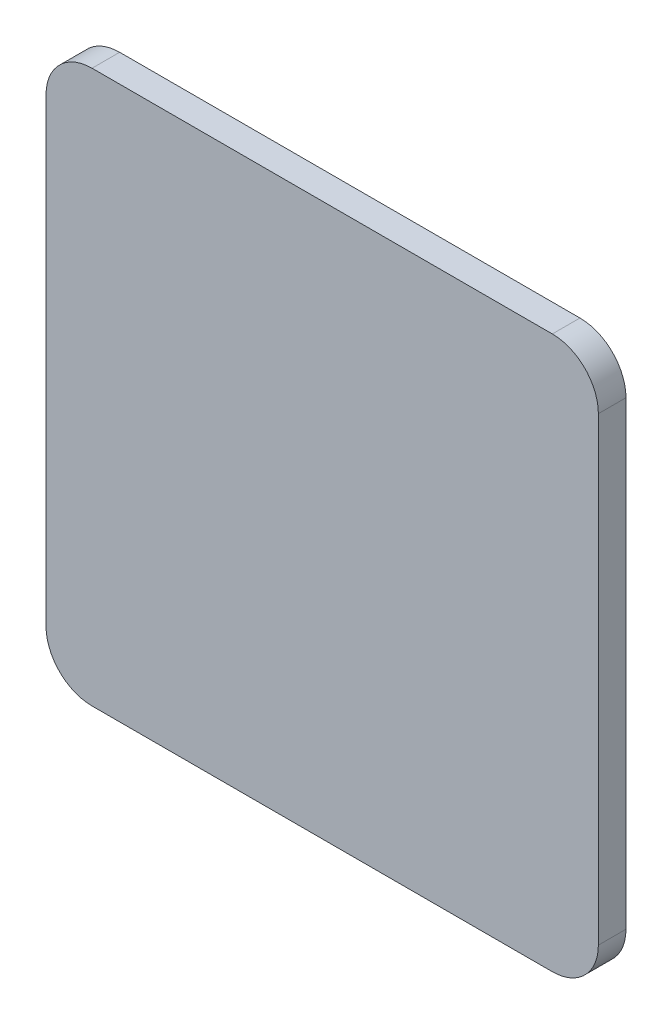
ISO-10303-21;
HEADER;
FILE_DESCRIPTION(('STEP AP214'),'2;1');
FILE_NAME('part.step','',(''),(''),'','','');
FILE_SCHEMA(('AUTOMOTIVE_DESIGN { 1 0 10303 214 1 1 1 1 }'));
ENDSEC;
DATA;
#1=APPLICATION_CONTEXT('core data for automotive mechanical design processes');
#2=APPLICATION_PROTOCOL_DEFINITION('international standard','automotive_design',2000,#1);
#3=PRODUCT_CONTEXT('',#1,'mechanical');
#4=PRODUCT('Part','Part','',(#3));
#5=PRODUCT_RELATED_PRODUCT_CATEGORY('part','',(#4));
#6=PRODUCT_DEFINITION_FORMATION('','',#4);
#7=PRODUCT_DEFINITION_CONTEXT('part definition',#1,'design');
#8=PRODUCT_DEFINITION('design','',#6,#7);
#9=PRODUCT_DEFINITION_SHAPE('','',#8);
#10=(LENGTH_UNIT() NAMED_UNIT(*) SI_UNIT(.MILLI.,.METRE.));
#11=(NAMED_UNIT(*) PLANE_ANGLE_UNIT() SI_UNIT($,.RADIAN.));
#12=(NAMED_UNIT(*) SI_UNIT($,.STERADIAN.) SOLID_ANGLE_UNIT());
#13=UNCERTAINTY_MEASURE_WITH_UNIT(LENGTH_MEASURE(1.E-05),#10,'distance_accuracy_value','');
#14=(GEOMETRIC_REPRESENTATION_CONTEXT(3) GLOBAL_UNCERTAINTY_ASSIGNED_CONTEXT((#13)) GLOBAL_UNIT_ASSIGNED_CONTEXT((#10,
#11,#12)) REPRESENTATION_CONTEXT('',''));
#15=CARTESIAN_POINT('',(0.,0.,0.));
#16=DIRECTION('',(0.,0.,1.));
#17=DIRECTION('',(1.,0.,0.));
#18=AXIS2_PLACEMENT_3D('',#15,#16,#17);
#19=CARTESIAN_POINT('',(30.,-30.,1.5));
#20=DIRECTION('',(-1.,0.,0.));
#21=DIRECTION('',(0.,0.,1.));
#22=AXIS2_PLACEMENT_3D('',#19,#20,#21);
#23=PLANE('',#22);
#24=DIRECTION('',(0.,1.,0.));
#25=VECTOR('',#24,1.);
#26=CARTESIAN_POINT('',(30.,-30.,1.5));
#27=LINE('',#26,#25);
#28=CARTESIAN_POINT('',(30.,-25.,1.5));
#29=VERTEX_POINT('',#28);
#30=CARTESIAN_POINT('',(30.,25.,1.5));
#31=VERTEX_POINT('',#30);
#32=EDGE_CURVE('E136',#29,#31,#27,.T.);
#33=ORIENTED_EDGE('',*,*,#32,.F.);
#34=DIRECTION('',(0.,0.,-1.));
#35=VECTOR('',#34,1.);
#36=CARTESIAN_POINT('',(30.,-25.,1.5));
#37=LINE('',#36,#35);
#38=CARTESIAN_POINT('',(30.,-25.,-1.5));
#39=VERTEX_POINT('',#38);
#40=EDGE_CURVE('E11',#29,#39,#37,.T.);
#41=ORIENTED_EDGE('',*,*,#40,.T.);
#42=DIRECTION('',(0.,1.,0.));
#43=VECTOR('',#42,1.);
#44=CARTESIAN_POINT('',(30.,-30.,-1.5));
#45=LINE('',#44,#43);
#46=CARTESIAN_POINT('',(30.,25.,-1.5));
#47=VERTEX_POINT('',#46);
#48=EDGE_CURVE('E138',#39,#47,#45,.T.);
#49=ORIENTED_EDGE('',*,*,#48,.T.);
#50=DIRECTION('',(0.,0.,-1.));
#51=VECTOR('',#50,1.);
#52=CARTESIAN_POINT('',(30.,25.,1.5));
#53=LINE('',#52,#51);
#54=EDGE_CURVE('E49',#47,#31,#53,.F.);
#55=ORIENTED_EDGE('',*,*,#54,.T.);
#56=EDGE_LOOP('',(#33,#41,#49,#55));
#57=FACE_BOUND('',#56,.T.);
#58=ADVANCED_FACE('F41',(#57),#23,.F.);
#59=CARTESIAN_POINT('',(-30.,30.,1.5));
#60=DIRECTION('',(0.,-1.,0.));
#61=DIRECTION('',(0.,0.,-1.));
#62=AXIS2_PLACEMENT_3D('',#59,#60,#61);
#63=PLANE('',#62);
#64=DIRECTION('',(-1.,0.,0.));
#65=VECTOR('',#64,1.);
#66=CARTESIAN_POINT('',(-30.,30.,-1.5));
#67=LINE('',#66,#65);
#68=CARTESIAN_POINT('',(25.,30.,-1.5));
#69=VERTEX_POINT('',#68);
#70=CARTESIAN_POINT('',(-25.,30.,-1.5));
#71=VERTEX_POINT('',#70);
#72=EDGE_CURVE('E134',#69,#71,#67,.T.);
#73=ORIENTED_EDGE('',*,*,#72,.T.);
#74=DIRECTION('',(0.,0.,-1.));
#75=VECTOR('',#74,1.);
#76=CARTESIAN_POINT('',(-25.,30.,1.5));
#77=LINE('',#76,#75);
#78=CARTESIAN_POINT('',(-25.,30.,1.5));
#79=VERTEX_POINT('',#78);
#80=EDGE_CURVE('E113',#71,#79,#77,.F.);
#81=ORIENTED_EDGE('',*,*,#80,.T.);
#82=DIRECTION('',(-1.,0.,0.));
#83=VECTOR('',#82,1.);
#84=CARTESIAN_POINT('',(-30.,30.,1.5));
#85=LINE('',#84,#83);
#86=CARTESIAN_POINT('',(25.,30.,1.5));
#87=VERTEX_POINT('',#86);
#88=EDGE_CURVE('E174',#87,#79,#85,.T.);
#89=ORIENTED_EDGE('',*,*,#88,.F.);
#90=DIRECTION('',(0.,0.,-1.));
#91=VECTOR('',#90,1.);
#92=CARTESIAN_POINT('',(25.,30.,1.5));
#93=LINE('',#92,#91);
#94=EDGE_CURVE('E118',#87,#69,#93,.T.);
#95=ORIENTED_EDGE('',*,*,#94,.T.);
#96=EDGE_LOOP('',(#73,#81,#89,#95));
#97=FACE_BOUND('',#96,.T.);
#98=ADVANCED_FACE('F178',(#97),#63,.F.);
#99=CARTESIAN_POINT('',(-30.,-30.,1.5));
#100=DIRECTION('',(1.,0.,0.));
#101=DIRECTION('',(0.,0.,-1.));
#102=AXIS2_PLACEMENT_3D('',#99,#100,#101);
#103=PLANE('',#102);
#104=DIRECTION('',(0.,-1.,0.));
#105=VECTOR('',#104,1.);
#106=CARTESIAN_POINT('',(-30.,-30.,1.5));
#107=LINE('',#106,#105);
#108=CARTESIAN_POINT('',(-30.,25.,1.5));
#109=VERTEX_POINT('',#108);
#110=CARTESIAN_POINT('',(-30.,-25.,1.5));
#111=VERTEX_POINT('',#110);
#112=EDGE_CURVE('E127',#109,#111,#107,.T.);
#113=ORIENTED_EDGE('',*,*,#112,.F.);
#114=DIRECTION('',(0.,0.,-1.));
#115=VECTOR('',#114,1.);
#116=CARTESIAN_POINT('',(-30.,25.,1.5));
#117=LINE('',#116,#115);
#118=CARTESIAN_POINT('',(-30.,25.,-1.5));
#119=VERTEX_POINT('',#118);
#120=EDGE_CURVE('E112',#109,#119,#117,.T.);
#121=ORIENTED_EDGE('',*,*,#120,.T.);
#122=DIRECTION('',(0.,-1.,0.));
#123=VECTOR('',#122,1.);
#124=CARTESIAN_POINT('',(-30.,-30.,-1.5));
#125=LINE('',#124,#123);
#126=CARTESIAN_POINT('',(-30.,-25.,-1.5));
#127=VERTEX_POINT('',#126);
#128=EDGE_CURVE('E125',#119,#127,#125,.T.);
#129=ORIENTED_EDGE('',*,*,#128,.T.);
#130=DIRECTION('',(0.,0.,-1.));
#131=VECTOR('',#130,1.);
#132=CARTESIAN_POINT('',(-30.,-25.,1.5));
#133=LINE('',#132,#131);
#134=EDGE_CURVE('E129',#127,#111,#133,.F.);
#135=ORIENTED_EDGE('',*,*,#134,.T.);
#136=EDGE_LOOP('',(#113,#121,#129,#135));
#137=FACE_BOUND('',#136,.T.);
#138=ADVANCED_FACE('F124',(#137),#103,.F.);
#139=CARTESIAN_POINT('',(-30.,-30.,1.5));
#140=DIRECTION('',(0.,1.,0.));
#141=DIRECTION('',(0.,0.,1.));
#142=AXIS2_PLACEMENT_3D('',#139,#140,#141);
#143=PLANE('',#142);
#144=DIRECTION('',(1.,0.,0.));
#145=VECTOR('',#144,1.);
#146=CARTESIAN_POINT('',(-30.,-30.,1.5));
#147=LINE('',#146,#145);
#148=CARTESIAN_POINT('',(-25.,-30.,1.5));
#149=VERTEX_POINT('',#148);
#150=CARTESIAN_POINT('',(25.,-30.,1.5));
#151=VERTEX_POINT('',#150);
#152=EDGE_CURVE('E142',#149,#151,#147,.T.);
#153=ORIENTED_EDGE('',*,*,#152,.F.);
#154=DIRECTION('',(0.,0.,-1.));
#155=VECTOR('',#154,1.);
#156=CARTESIAN_POINT('',(-25.,-30.,1.5));
#157=LINE('',#156,#155);
#158=CARTESIAN_POINT('',(-25.,-30.,-1.5));
#159=VERTEX_POINT('',#158);
#160=EDGE_CURVE('E159',#149,#159,#157,.T.);
#161=ORIENTED_EDGE('',*,*,#160,.T.);
#162=DIRECTION('',(1.,0.,0.));
#163=VECTOR('',#162,1.);
#164=CARTESIAN_POINT('',(-30.,-30.,-1.5));
#165=LINE('',#164,#163);
#166=CARTESIAN_POINT('',(25.,-30.,-1.5));
#167=VERTEX_POINT('',#166);
#168=EDGE_CURVE('E133',#159,#167,#165,.T.);
#169=ORIENTED_EDGE('',*,*,#168,.T.);
#170=DIRECTION('',(0.,0.,-1.));
#171=VECTOR('',#170,1.);
#172=CARTESIAN_POINT('',(25.,-30.,1.5));
#173=LINE('',#172,#171);
#174=EDGE_CURVE('E56',#167,#151,#173,.F.);
#175=ORIENTED_EDGE('',*,*,#174,.T.);
#176=EDGE_LOOP('',(#153,#161,#169,#175));
#177=FACE_BOUND('',#176,.T.);
#178=ADVANCED_FACE('F185',(#177),#143,.F.);
#179=CARTESIAN_POINT('',(0.,0.,1.5));
#180=DIRECTION('',(0.,0.,-1.));
#181=DIRECTION('',(-1.,0.,0.));
#182=AXIS2_PLACEMENT_3D('',#179,#180,#181);
#183=PLANE('',#182);
#184=ORIENTED_EDGE('',*,*,#88,.T.);
#185=CARTESIAN_POINT('',(-25.,25.,1.5));
#186=DIRECTION('',(0.,0.,-1.));
#187=DIRECTION('',(-1.,0.,0.));
#188=AXIS2_PLACEMENT_3D('',#185,#186,#187);
#189=CIRCLE('',#188,5.);
#190=EDGE_CURVE('E156',#79,#109,#189,.F.);
#191=ORIENTED_EDGE('',*,*,#190,.T.);
#192=ORIENTED_EDGE('',*,*,#112,.T.);
#193=CARTESIAN_POINT('',(-25.,-25.,1.5));
#194=DIRECTION('',(0.,0.,-1.));
#195=DIRECTION('',(-1.,0.,0.));
#196=AXIS2_PLACEMENT_3D('',#193,#194,#195);
#197=CIRCLE('',#196,5.);
#198=EDGE_CURVE('E63',#111,#149,#197,.F.);
#199=ORIENTED_EDGE('',*,*,#198,.T.);
#200=ORIENTED_EDGE('',*,*,#152,.T.);
#201=CARTESIAN_POINT('',(25.,-25.,1.5));
#202=DIRECTION('',(0.,0.,-1.));
#203=DIRECTION('',(-1.,0.,0.));
#204=AXIS2_PLACEMENT_3D('',#201,#202,#203);
#205=CIRCLE('',#204,5.);
#206=EDGE_CURVE('E153',#151,#29,#205,.F.);
#207=ORIENTED_EDGE('',*,*,#206,.T.);
#208=ORIENTED_EDGE('',*,*,#32,.T.);
#209=CARTESIAN_POINT('',(25.,25.,1.5));
#210=DIRECTION('',(0.,0.,-1.));
#211=DIRECTION('',(-1.,0.,0.));
#212=AXIS2_PLACEMENT_3D('',#209,#210,#211);
#213=CIRCLE('',#212,5.);
#214=EDGE_CURVE('E151',#31,#87,#213,.F.);
#215=ORIENTED_EDGE('',*,*,#214,.T.);
#216=EDGE_LOOP('',(#184,#191,#192,#199,#200,#207,#208,#215));
#217=FACE_BOUND('',#216,.T.);
#218=ADVANCED_FACE('F171',(#217),#183,.F.);
#219=CARTESIAN_POINT('',(0.,0.,-1.5));
#220=DIRECTION('',(0.,0.,-1.));
#221=DIRECTION('',(-1.,0.,0.));
#222=AXIS2_PLACEMENT_3D('',#219,#220,#221);
#223=PLANE('',#222);
#224=ORIENTED_EDGE('',*,*,#128,.F.);
#225=CARTESIAN_POINT('',(-25.,25.,-1.5));
#226=DIRECTION('',(0.,0.,-1.));
#227=DIRECTION('',(-1.,0.,0.));
#228=AXIS2_PLACEMENT_3D('',#225,#226,#227);
#229=CIRCLE('',#228,5.);
#230=EDGE_CURVE('E108',#119,#71,#229,.T.);
#231=ORIENTED_EDGE('',*,*,#230,.T.);
#232=ORIENTED_EDGE('',*,*,#72,.F.);
#233=CARTESIAN_POINT('',(25.,25.,-1.5));
#234=DIRECTION('',(0.,0.,-1.));
#235=DIRECTION('',(-1.,0.,0.));
#236=AXIS2_PLACEMENT_3D('',#233,#234,#235);
#237=CIRCLE('',#236,5.);
#238=EDGE_CURVE('E128',#69,#47,#237,.T.);
#239=ORIENTED_EDGE('',*,*,#238,.T.);
#240=ORIENTED_EDGE('',*,*,#48,.F.);
#241=CARTESIAN_POINT('',(25.,-25.,-1.5));
#242=DIRECTION('',(0.,0.,-1.));
#243=DIRECTION('',(-1.,0.,0.));
#244=AXIS2_PLACEMENT_3D('',#241,#242,#243);
#245=CIRCLE('',#244,5.);
#246=EDGE_CURVE('E145',#39,#167,#245,.T.);
#247=ORIENTED_EDGE('',*,*,#246,.T.);
#248=ORIENTED_EDGE('',*,*,#168,.F.);
#249=CARTESIAN_POINT('',(-25.,-25.,-1.5));
#250=DIRECTION('',(0.,0.,-1.));
#251=DIRECTION('',(-1.,0.,0.));
#252=AXIS2_PLACEMENT_3D('',#249,#250,#251);
#253=CIRCLE('',#252,5.);
#254=EDGE_CURVE('E119',#159,#127,#253,.T.);
#255=ORIENTED_EDGE('',*,*,#254,.T.);
#256=EDGE_LOOP('',(#224,#231,#232,#239,#240,#247,#248,#255));
#257=FACE_BOUND('',#256,.T.);
#258=ADVANCED_FACE('F131',(#257),#223,.T.);
#259=CARTESIAN_POINT('',(-25.,25.,1.5));
#260=DIRECTION('',(0.,0.,-1.));
#261=DIRECTION('',(-1.,0.,0.));
#262=AXIS2_PLACEMENT_3D('',#259,#260,#261);
#263=CYLINDRICAL_SURFACE('',#262,5.);
#264=ORIENTED_EDGE('',*,*,#190,.F.);
#265=ORIENTED_EDGE('',*,*,#80,.F.);
#266=ORIENTED_EDGE('',*,*,#230,.F.);
#267=ORIENTED_EDGE('',*,*,#120,.F.);
#268=EDGE_LOOP('',(#264,#265,#266,#267));
#269=FACE_BOUND('',#268,.T.);
#270=ADVANCED_FACE('F111',(#269),#263,.T.);
#271=CARTESIAN_POINT('',(-25.,-25.,1.5));
#272=DIRECTION('',(0.,0.,-1.));
#273=DIRECTION('',(-1.,0.,0.));
#274=AXIS2_PLACEMENT_3D('',#271,#272,#273);
#275=CYLINDRICAL_SURFACE('',#274,5.);
#276=ORIENTED_EDGE('',*,*,#198,.F.);
#277=ORIENTED_EDGE('',*,*,#134,.F.);
#278=ORIENTED_EDGE('',*,*,#254,.F.);
#279=ORIENTED_EDGE('',*,*,#160,.F.);
#280=EDGE_LOOP('',(#276,#277,#278,#279));
#281=FACE_BOUND('',#280,.T.);
#282=ADVANCED_FACE('F184',(#281),#275,.T.);
#283=CARTESIAN_POINT('',(25.,-25.,1.5));
#284=DIRECTION('',(0.,0.,-1.));
#285=DIRECTION('',(-1.,0.,0.));
#286=AXIS2_PLACEMENT_3D('',#283,#284,#285);
#287=CYLINDRICAL_SURFACE('',#286,5.);
#288=ORIENTED_EDGE('',*,*,#206,.F.);
#289=ORIENTED_EDGE('',*,*,#174,.F.);
#290=ORIENTED_EDGE('',*,*,#246,.F.);
#291=ORIENTED_EDGE('',*,*,#40,.F.);
#292=EDGE_LOOP('',(#288,#289,#290,#291));
#293=FACE_BOUND('',#292,.T.);
#294=ADVANCED_FACE('F187',(#293),#287,.T.);
#295=CARTESIAN_POINT('',(25.,25.,1.5));
#296=DIRECTION('',(0.,0.,-1.));
#297=DIRECTION('',(-1.,0.,0.));
#298=AXIS2_PLACEMENT_3D('',#295,#296,#297);
#299=CYLINDRICAL_SURFACE('',#298,5.);
#300=ORIENTED_EDGE('',*,*,#214,.F.);
#301=ORIENTED_EDGE('',*,*,#54,.F.);
#302=ORIENTED_EDGE('',*,*,#238,.F.);
#303=ORIENTED_EDGE('',*,*,#94,.F.);
#304=EDGE_LOOP('',(#300,#301,#302,#303));
#305=FACE_BOUND('',#304,.T.);
#306=ADVANCED_FACE('F43',(#305),#299,.T.);
#307=CLOSED_SHELL('',(#58,#98,#138,#178,#218,#258,#270,#282,#294,#306));
#308=MANIFOLD_SOLID_BREP('B2',#307);
#309=ADVANCED_BREP_SHAPE_REPRESENTATION('',(#18,#308),#14);
#310=SHAPE_DEFINITION_REPRESENTATION(#9,#309);
ENDSEC;
END-ISO-10303-21;
